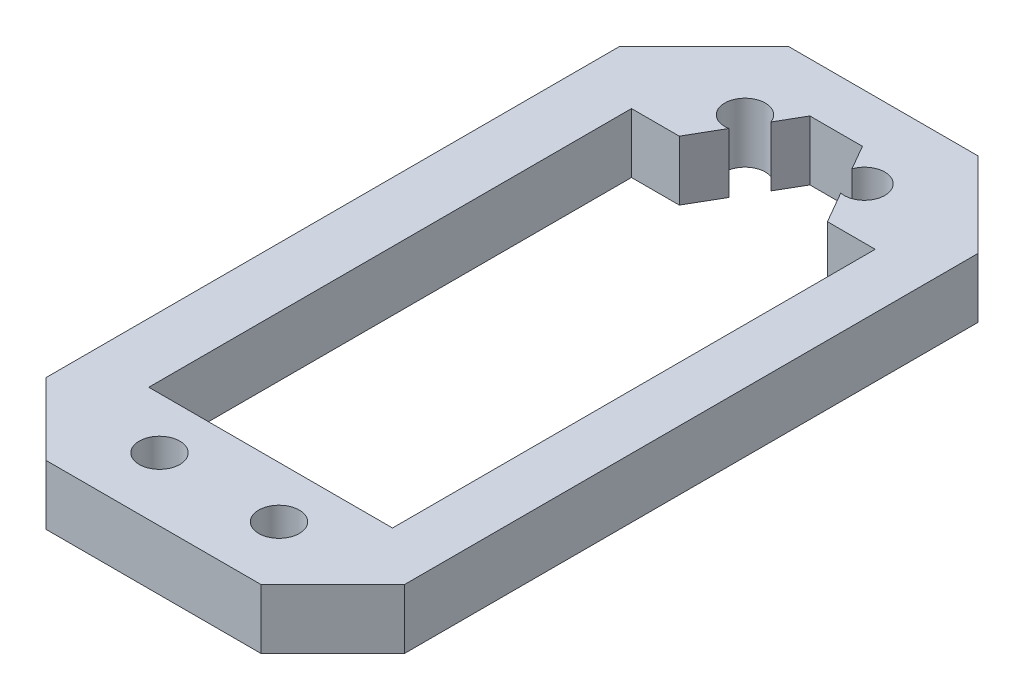
ISO-10303-21;
HEADER;
FILE_DESCRIPTION(('STEP AP214'),'2;1');
FILE_NAME('part.step','',(''),(''),'','','');
FILE_SCHEMA(('AUTOMOTIVE_DESIGN { 1 0 10303 214 1 1 1 1 }'));
ENDSEC;
DATA;
#1=APPLICATION_CONTEXT('core data for automotive mechanical design processes');
#2=APPLICATION_PROTOCOL_DEFINITION('international standard','automotive_design',2000,#1);
#3=PRODUCT_CONTEXT('',#1,'mechanical');
#4=PRODUCT('Part','Part','',(#3));
#5=PRODUCT_RELATED_PRODUCT_CATEGORY('part','',(#4));
#6=PRODUCT_DEFINITION_FORMATION('','',#4);
#7=PRODUCT_DEFINITION_CONTEXT('part definition',#1,'design');
#8=PRODUCT_DEFINITION('design','',#6,#7);
#9=PRODUCT_DEFINITION_SHAPE('','',#8);
#10=(LENGTH_UNIT() NAMED_UNIT(*) SI_UNIT(.MILLI.,.METRE.));
#11=(NAMED_UNIT(*) PLANE_ANGLE_UNIT() SI_UNIT($,.RADIAN.));
#12=(NAMED_UNIT(*) SI_UNIT($,.STERADIAN.) SOLID_ANGLE_UNIT());
#13=UNCERTAINTY_MEASURE_WITH_UNIT(LENGTH_MEASURE(1.E-05),#10,'distance_accuracy_value','');
#14=(GEOMETRIC_REPRESENTATION_CONTEXT(3) GLOBAL_UNCERTAINTY_ASSIGNED_CONTEXT((#13)) GLOBAL_UNIT_ASSIGNED_CONTEXT((#10,
#11,#12)) REPRESENTATION_CONTEXT('',''));
#15=CARTESIAN_POINT('',(0.,0.,0.));
#16=DIRECTION('',(0.,0.,1.));
#17=DIRECTION('',(1.,0.,0.));
#18=AXIS2_PLACEMENT_3D('',#15,#16,#17);
#19=CARTESIAN_POINT('',(0.,5.,0.));
#20=DIRECTION('',(0.,-1.,0.));
#21=DIRECTION('',(0.,0.,-1.));
#22=AXIS2_PLACEMENT_3D('',#19,#20,#21);
#23=PLANE('',#22);
#24=DIRECTION('',(-0.707106781186547,0.,-0.707106781186547));
#25=VECTOR('',#24,1.);
#26=CARTESIAN_POINT('',(1439.01159534853,5.,-1417.86320996286));
#27=LINE('',#26,#25);
#28=CARTESIAN_POINT('',(1439.01159534853,5.,-1417.86320996286));
#29=VERTEX_POINT('',#28);
#30=CARTESIAN_POINT('',(1431.94052753666,5.,-1424.93427777473));
#31=VERTEX_POINT('',#30);
#32=EDGE_CURVE('E319',#29,#31,#27,.T.);
#33=ORIENTED_EDGE('',*,*,#32,.T.);
#34=DIRECTION('',(-1.,0.,0.));
#35=VECTOR('',#34,1.);
#36=CARTESIAN_POINT('',(1431.94052753666,5.,-1424.93427777473));
#37=LINE('',#36,#35);
#38=CARTESIAN_POINT('',(1416.08266316039,5.,-1424.93427777473));
#39=VERTEX_POINT('',#38);
#40=EDGE_CURVE('E323',#31,#39,#37,.T.);
#41=ORIENTED_EDGE('',*,*,#40,.T.);
#42=DIRECTION('',(-0.707106781186547,0.,0.707106781186547));
#43=VECTOR('',#42,1.);
#44=CARTESIAN_POINT('',(1409.01159534853,5.,-1417.86320996286));
#45=LINE('',#44,#43);
#46=CARTESIAN_POINT('',(1409.01159534853,5.,-1417.86320996286));
#47=VERTEX_POINT('',#46);
#48=EDGE_CURVE('E327',#39,#47,#45,.T.);
#49=ORIENTED_EDGE('',*,*,#48,.T.);
#50=DIRECTION('',(0.,0.,1.));
#51=VECTOR('',#50,1.);
#52=CARTESIAN_POINT('',(1409.01159534853,5.,-1369.86320996286));
#53=LINE('',#52,#51);
#54=CARTESIAN_POINT('',(1409.01159534853,5.,-1369.86320996286));
#55=VERTEX_POINT('',#54);
#56=EDGE_CURVE('E330',#47,#55,#53,.T.);
#57=ORIENTED_EDGE('',*,*,#56,.T.);
#58=DIRECTION('',(0.707106781186547,0.,0.707106781186547));
#59=VECTOR('',#58,1.);
#60=CARTESIAN_POINT('',(1415.01159534853,5.,-1363.86320996286));
#61=LINE('',#60,#59);
#62=CARTESIAN_POINT('',(1415.01159534853,5.,-1363.86320996286));
#63=VERTEX_POINT('',#62);
#64=EDGE_CURVE('E333',#55,#63,#61,.T.);
#65=ORIENTED_EDGE('',*,*,#64,.T.);
#66=DIRECTION('',(1.,0.,0.));
#67=VECTOR('',#66,1.);
#68=CARTESIAN_POINT('',(1433.01159534853,5.,-1363.86320996286));
#69=LINE('',#68,#67);
#70=CARTESIAN_POINT('',(1433.01159534853,5.,-1363.86320996286));
#71=VERTEX_POINT('',#70);
#72=EDGE_CURVE('E336',#63,#71,#69,.T.);
#73=ORIENTED_EDGE('',*,*,#72,.T.);
#74=DIRECTION('',(0.707106781186547,0.,-0.707106781186547));
#75=VECTOR('',#74,1.);
#76=CARTESIAN_POINT('',(1439.01159534853,5.,-1369.86320996286));
#77=LINE('',#76,#75);
#78=CARTESIAN_POINT('',(1439.01159534853,5.,-1369.86320996286));
#79=VERTEX_POINT('',#78);
#80=EDGE_CURVE('E339',#71,#79,#77,.T.);
#81=ORIENTED_EDGE('',*,*,#80,.T.);
#82=DIRECTION('',(0.,0.,-1.));
#83=VECTOR('',#82,1.);
#84=CARTESIAN_POINT('',(1439.01159534853,5.,-1417.86320996286));
#85=LINE('',#84,#83);
#86=EDGE_CURVE('E342',#79,#29,#85,.T.);
#87=ORIENTED_EDGE('',*,*,#86,.T.);
#88=EDGE_LOOP('',(#33,#41,#49,#57,#65,#73,#81,#87));
#89=FACE_BOUND('',#88,.T.);
#90=DIRECTION('',(-1.,0.,0.));
#91=VECTOR('',#90,1.);
#92=CARTESIAN_POINT('',(1434.41159534853,5.,-1413.86320996286));
#93=LINE('',#92,#91);
#94=CARTESIAN_POINT('',(1434.41159534853,5.,-1413.86320996286));
#95=VERTEX_POINT('',#94);
#96=CARTESIAN_POINT('',(1430.41159534853,5.,-1413.86320996286));
#97=VERTEX_POINT('',#96);
#98=EDGE_CURVE('E187',#95,#97,#93,.T.);
#99=ORIENTED_EDGE('',*,*,#98,.F.);
#100=DIRECTION('',(0.,0.,-1.));
#101=VECTOR('',#100,1.);
#102=CARTESIAN_POINT('',(1434.41159534853,5.,-1413.86320996286));
#103=LINE('',#102,#101);
#104=CARTESIAN_POINT('',(1434.41159534853,5.,-1373.46320996286));
#105=VERTEX_POINT('',#104);
#106=EDGE_CURVE('E242',#105,#95,#103,.T.);
#107=ORIENTED_EDGE('',*,*,#106,.F.);
#108=DIRECTION('',(1.,0.,0.));
#109=VECTOR('',#108,1.);
#110=CARTESIAN_POINT('',(1434.41159534853,5.,-1373.46320996286));
#111=LINE('',#110,#109);
#112=CARTESIAN_POINT('',(1414.01159534853,5.,-1373.46320996286));
#113=VERTEX_POINT('',#112);
#114=EDGE_CURVE('E239',#113,#105,#111,.T.);
#115=ORIENTED_EDGE('',*,*,#114,.F.);
#116=DIRECTION('',(0.,0.,1.));
#117=VECTOR('',#116,1.);
#118=CARTESIAN_POINT('',(1414.01159534853,5.,-1373.46320996286));
#119=LINE('',#118,#117);
#120=CARTESIAN_POINT('',(1414.01159534853,5.,-1413.86320996286));
#121=VERTEX_POINT('',#120);
#122=EDGE_CURVE('E236',#121,#113,#119,.T.);
#123=ORIENTED_EDGE('',*,*,#122,.F.);
#124=DIRECTION('',(-1.,0.,0.));
#125=VECTOR('',#124,1.);
#126=CARTESIAN_POINT('',(1414.01159534853,5.,-1413.86320996286));
#127=LINE('',#126,#125);
#128=CARTESIAN_POINT('',(1418.01159534853,5.,-1413.86320996286));
#129=VERTEX_POINT('',#128);
#130=EDGE_CURVE('E233',#129,#121,#127,.T.);
#131=ORIENTED_EDGE('',*,*,#130,.F.);
#132=DIRECTION('',(-0.499999999999981,0.,0.866025403784449));
#133=VECTOR('',#132,1.);
#134=CARTESIAN_POINT('',(1418.01159534853,5.,-1413.86320996286));
#135=LINE('',#134,#133);
#136=CARTESIAN_POINT('',(1419.5300845279,5.,-1416.49331037228));
#137=VERTEX_POINT('',#136);
#138=EDGE_CURVE('E230',#137,#129,#135,.T.);
#139=ORIENTED_EDGE('',*,*,#138,.F.);
#140=CARTESIAN_POINT('',(1419.21159534853,5.,-1418.16320996286));
#141=DIRECTION('',(0.,1.,0.));
#142=DIRECTION('',(0.,0.,1.));
#143=AXIS2_PLACEMENT_3D('',#140,#141,#142);
#144=CIRCLE('',#143,1.69999999999992);
#145=CARTESIAN_POINT('',(1420.81701540543,5.,-1418.72234003799));
#146=VERTEX_POINT('',#145);
#147=EDGE_CURVE('E227',#146,#137,#144,.T.);
#148=ORIENTED_EDGE('',*,*,#147,.F.);
#149=DIRECTION('',(-0.49999999999999,0.,0.866025403784444));
#150=VECTOR('',#149,1.);
#151=CARTESIAN_POINT('',(1420.81701540543,5.,-1418.72234003799));
#152=LINE('',#151,#150);
#153=CARTESIAN_POINT('',(1422.01159534853,5.,-1420.79141319314));
#154=VERTEX_POINT('',#153);
#155=EDGE_CURVE('E224',#154,#146,#152,.T.);
#156=ORIENTED_EDGE('',*,*,#155,.F.);
#157=DIRECTION('',(-1.,0.,0.));
#158=VECTOR('',#157,1.);
#159=CARTESIAN_POINT('',(1426.41159534853,5.,-1420.79141319314));
#160=LINE('',#159,#158);
#161=CARTESIAN_POINT('',(1426.41159534853,5.,-1420.79141319314));
#162=VERTEX_POINT('',#161);
#163=EDGE_CURVE('E221',#162,#154,#160,.T.);
#164=ORIENTED_EDGE('',*,*,#163,.F.);
#165=DIRECTION('',(-0.500000000000049,0.,-0.86602540378441));
#166=VECTOR('',#165,1.);
#167=CARTESIAN_POINT('',(1427.60617529163,5.,-1418.72234003799));
#168=LINE('',#167,#166);
#169=CARTESIAN_POINT('',(1427.60617529163,5.,-1418.72234003799));
#170=VERTEX_POINT('',#169);
#171=EDGE_CURVE('E215',#170,#162,#168,.T.);
#172=ORIENTED_EDGE('',*,*,#171,.F.);
#173=CARTESIAN_POINT('',(1429.21159534853,5.,-1418.16320996286));
#174=DIRECTION('',(0.,1.,0.));
#175=DIRECTION('',(0.,0.,1.));
#176=AXIS2_PLACEMENT_3D('',#173,#174,#175);
#177=CIRCLE('',#176,1.7);
#178=CARTESIAN_POINT('',(1428.89310616915,5.,-1416.49331037228));
#179=VERTEX_POINT('',#178);
#180=EDGE_CURVE('E211',#179,#170,#177,.T.);
#181=ORIENTED_EDGE('',*,*,#180,.F.);
#182=DIRECTION('',(-0.499999999999918,0.,-0.866025403784486));
#183=VECTOR('',#182,1.);
#184=CARTESIAN_POINT('',(1430.41159534853,5.,-1413.86320996286));
#185=LINE('',#184,#183);
#186=EDGE_CURVE('E196',#97,#179,#185,.T.);
#187=ORIENTED_EDGE('',*,*,#186,.F.);
#188=EDGE_LOOP('',(#99,#107,#115,#123,#131,#139,#148,#156,#164,#172,#181,#187));
#189=FACE_BOUND('',#188,.T.);
#190=CARTESIAN_POINT('',(1429.21159534853,5.,-1369.16320996286));
#191=DIRECTION('',(0.,1.,0.));
#192=DIRECTION('',(0.,0.,1.));
#193=AXIS2_PLACEMENT_3D('',#190,#191,#192);
#194=CIRCLE('',#193,1.70000000000003);
#195=CARTESIAN_POINT('',(1429.21159534853,5.,-1367.46320996286));
#196=VERTEX_POINT('',#195);
#197=EDGE_CURVE('E247',#196,#196,#194,.T.);
#198=ORIENTED_EDGE('',*,*,#197,.F.);
#199=EDGE_LOOP('',(#198));
#200=FACE_BOUND('',#199,.T.);
#201=CARTESIAN_POINT('',(1419.21159534853,5.,-1369.16320996286));
#202=DIRECTION('',(0.,1.,0.));
#203=DIRECTION('',(0.,0.,1.));
#204=AXIS2_PLACEMENT_3D('',#201,#202,#203);
#205=CIRCLE('',#204,1.70000000000003);
#206=CARTESIAN_POINT('',(1419.21159534853,5.,-1367.46320996286));
#207=VERTEX_POINT('',#206);
#208=EDGE_CURVE('E513',#207,#207,#205,.T.);
#209=ORIENTED_EDGE('',*,*,#208,.F.);
#210=EDGE_LOOP('',(#209));
#211=FACE_BOUND('',#210,.T.);
#212=ADVANCED_FACE('F49',(#89,#189,#200,#211),#23,.F.);
#213=CARTESIAN_POINT('',(0.,0.,0.));
#214=DIRECTION('',(0.,-1.,0.));
#215=DIRECTION('',(0.,0.,-1.));
#216=AXIS2_PLACEMENT_3D('',#213,#214,#215);
#217=PLANE('',#216);
#218=CARTESIAN_POINT('',(1429.21159534853,0.,-1369.16320996286));
#219=DIRECTION('',(0.,1.,0.));
#220=DIRECTION('',(0.,0.,1.));
#221=AXIS2_PLACEMENT_3D('',#218,#219,#220);
#222=CIRCLE('',#221,1.70000000000003);
#223=CARTESIAN_POINT('',(1429.21159534853,0.,-1367.46320996286));
#224=VERTEX_POINT('',#223);
#225=EDGE_CURVE('E521',#224,#224,#222,.T.);
#226=ORIENTED_EDGE('',*,*,#225,.T.);
#227=EDGE_LOOP('',(#226));
#228=FACE_BOUND('',#227,.T.);
#229=DIRECTION('',(-0.707106781186547,0.,-0.707106781186547));
#230=VECTOR('',#229,1.);
#231=CARTESIAN_POINT('',(1439.01159534853,0.,-1417.86320996286));
#232=LINE('',#231,#230);
#233=CARTESIAN_POINT('',(1439.01159534853,0.,-1417.86320996286));
#234=VERTEX_POINT('',#233);
#235=CARTESIAN_POINT('',(1431.94052753666,0.,-1424.93427777473));
#236=VERTEX_POINT('',#235);
#237=EDGE_CURVE('E205',#234,#236,#232,.T.);
#238=ORIENTED_EDGE('',*,*,#237,.F.);
#239=DIRECTION('',(0.,0.,-1.));
#240=VECTOR('',#239,1.);
#241=CARTESIAN_POINT('',(1439.01159534853,0.,-1417.86320996286));
#242=LINE('',#241,#240);
#243=CARTESIAN_POINT('',(1439.01159534853,0.,-1369.86320996286));
#244=VERTEX_POINT('',#243);
#245=EDGE_CURVE('E324',#244,#234,#242,.T.);
#246=ORIENTED_EDGE('',*,*,#245,.F.);
#247=DIRECTION('',(0.707106781186547,0.,-0.707106781186547));
#248=VECTOR('',#247,1.);
#249=CARTESIAN_POINT('',(1439.01159534853,0.,-1369.86320996286));
#250=LINE('',#249,#248);
#251=CARTESIAN_POINT('',(1433.01159534853,0.,-1363.86320996286));
#252=VERTEX_POINT('',#251);
#253=EDGE_CURVE('E364',#252,#244,#250,.T.);
#254=ORIENTED_EDGE('',*,*,#253,.F.);
#255=DIRECTION('',(1.,0.,0.));
#256=VECTOR('',#255,1.);
#257=CARTESIAN_POINT('',(1433.01159534853,0.,-1363.86320996286));
#258=LINE('',#257,#256);
#259=CARTESIAN_POINT('',(1415.01159534853,0.,-1363.86320996286));
#260=VERTEX_POINT('',#259);
#261=EDGE_CURVE('E361',#260,#252,#258,.T.);
#262=ORIENTED_EDGE('',*,*,#261,.F.);
#263=DIRECTION('',(0.707106781186547,0.,0.707106781186547));
#264=VECTOR('',#263,1.);
#265=CARTESIAN_POINT('',(1415.01159534853,0.,-1363.86320996286));
#266=LINE('',#265,#264);
#267=CARTESIAN_POINT('',(1409.01159534853,0.,-1369.86320996286));
#268=VERTEX_POINT('',#267);
#269=EDGE_CURVE('E358',#268,#260,#266,.T.);
#270=ORIENTED_EDGE('',*,*,#269,.F.);
#271=DIRECTION('',(0.,0.,1.));
#272=VECTOR('',#271,1.);
#273=CARTESIAN_POINT('',(1409.01159534853,0.,-1369.86320996286));
#274=LINE('',#273,#272);
#275=CARTESIAN_POINT('',(1409.01159534853,0.,-1417.86320996286));
#276=VERTEX_POINT('',#275);
#277=EDGE_CURVE('E355',#276,#268,#274,.T.);
#278=ORIENTED_EDGE('',*,*,#277,.F.);
#279=DIRECTION('',(-0.707106781186547,0.,0.707106781186547));
#280=VECTOR('',#279,1.);
#281=CARTESIAN_POINT('',(1409.01159534853,0.,-1417.86320996286));
#282=LINE('',#281,#280);
#283=CARTESIAN_POINT('',(1416.08266316039,0.,-1424.93427777473));
#284=VERTEX_POINT('',#283);
#285=EDGE_CURVE('E352',#284,#276,#282,.T.);
#286=ORIENTED_EDGE('',*,*,#285,.F.);
#287=DIRECTION('',(-1.,0.,0.));
#288=VECTOR('',#287,1.);
#289=CARTESIAN_POINT('',(1431.94052753666,0.,-1424.93427777473));
#290=LINE('',#289,#288);
#291=EDGE_CURVE('E349',#236,#284,#290,.T.);
#292=ORIENTED_EDGE('',*,*,#291,.F.);
#293=EDGE_LOOP('',(#238,#246,#254,#262,#270,#278,#286,#292));
#294=FACE_BOUND('',#293,.T.);
#295=DIRECTION('',(0.,0.,-1.));
#296=VECTOR('',#295,1.);
#297=CARTESIAN_POINT('',(1434.41159534853,0.,-1413.86320996286));
#298=LINE('',#297,#296);
#299=CARTESIAN_POINT('',(1434.41159534853,0.,-1373.46320996286));
#300=VERTEX_POINT('',#299);
#301=CARTESIAN_POINT('',(1434.41159534853,0.,-1413.86320996286));
#302=VERTEX_POINT('',#301);
#303=EDGE_CURVE('E197',#300,#302,#298,.T.);
#304=ORIENTED_EDGE('',*,*,#303,.T.);
#305=DIRECTION('',(-1.,0.,0.));
#306=VECTOR('',#305,1.);
#307=CARTESIAN_POINT('',(1434.41159534853,0.,-1413.86320996286));
#308=LINE('',#307,#306);
#309=CARTESIAN_POINT('',(1430.41159534853,0.,-1413.86320996286));
#310=VERTEX_POINT('',#309);
#311=EDGE_CURVE('E73',#302,#310,#308,.T.);
#312=ORIENTED_EDGE('',*,*,#311,.T.);
#313=DIRECTION('',(-0.499999999999918,0.,-0.866025403784486));
#314=VECTOR('',#313,1.);
#315=CARTESIAN_POINT('',(1430.41159534853,0.,-1413.86320996286));
#316=LINE('',#315,#314);
#317=CARTESIAN_POINT('',(1428.89310616915,0.,-1416.49331037228));
#318=VERTEX_POINT('',#317);
#319=EDGE_CURVE('E203',#310,#318,#316,.T.);
#320=ORIENTED_EDGE('',*,*,#319,.T.);
#321=CARTESIAN_POINT('',(1429.21159534853,0.,-1418.16320996286));
#322=DIRECTION('',(0.,1.,0.));
#323=DIRECTION('',(0.,0.,1.));
#324=AXIS2_PLACEMENT_3D('',#321,#322,#323);
#325=CIRCLE('',#324,1.7);
#326=CARTESIAN_POINT('',(1427.60617529163,0.,-1418.72234003799));
#327=VERTEX_POINT('',#326);
#328=EDGE_CURVE('E250',#318,#327,#325,.T.);
#329=ORIENTED_EDGE('',*,*,#328,.T.);
#330=DIRECTION('',(-0.500000000000049,0.,-0.86602540378441));
#331=VECTOR('',#330,1.);
#332=CARTESIAN_POINT('',(1427.60617529163,0.,-1418.72234003799));
#333=LINE('',#332,#331);
#334=CARTESIAN_POINT('',(1426.41159534853,0.,-1420.79141319314));
#335=VERTEX_POINT('',#334);
#336=EDGE_CURVE('E254',#327,#335,#333,.T.);
#337=ORIENTED_EDGE('',*,*,#336,.T.);
#338=DIRECTION('',(-1.,0.,0.));
#339=VECTOR('',#338,1.);
#340=CARTESIAN_POINT('',(1426.41159534853,0.,-1420.79141319314));
#341=LINE('',#340,#339);
#342=CARTESIAN_POINT('',(1422.01159534853,0.,-1420.79141319314));
#343=VERTEX_POINT('',#342);
#344=EDGE_CURVE('E258',#335,#343,#341,.T.);
#345=ORIENTED_EDGE('',*,*,#344,.T.);
#346=DIRECTION('',(-0.49999999999999,0.,0.866025403784444));
#347=VECTOR('',#346,1.);
#348=CARTESIAN_POINT('',(1420.81701540543,0.,-1418.72234003799));
#349=LINE('',#348,#347);
#350=CARTESIAN_POINT('',(1420.81701540543,0.,-1418.72234003799));
#351=VERTEX_POINT('',#350);
#352=EDGE_CURVE('E262',#343,#351,#349,.T.);
#353=ORIENTED_EDGE('',*,*,#352,.T.);
#354=CARTESIAN_POINT('',(1419.21159534853,0.,-1418.16320996286));
#355=DIRECTION('',(0.,1.,0.));
#356=DIRECTION('',(0.,0.,1.));
#357=AXIS2_PLACEMENT_3D('',#354,#355,#356);
#358=CIRCLE('',#357,1.69999999999992);
#359=CARTESIAN_POINT('',(1419.5300845279,0.,-1416.49331037228));
#360=VERTEX_POINT('',#359);
#361=EDGE_CURVE('E266',#351,#360,#358,.T.);
#362=ORIENTED_EDGE('',*,*,#361,.T.);
#363=DIRECTION('',(-0.499999999999981,0.,0.866025403784449));
#364=VECTOR('',#363,1.);
#365=CARTESIAN_POINT('',(1418.01159534853,0.,-1413.86320996286));
#366=LINE('',#365,#364);
#367=CARTESIAN_POINT('',(1418.01159534853,0.,-1413.86320996286));
#368=VERTEX_POINT('',#367);
#369=EDGE_CURVE('E270',#360,#368,#366,.T.);
#370=ORIENTED_EDGE('',*,*,#369,.T.);
#371=DIRECTION('',(-1.,0.,0.));
#372=VECTOR('',#371,1.);
#373=CARTESIAN_POINT('',(1414.01159534853,0.,-1413.86320996286));
#374=LINE('',#373,#372);
#375=CARTESIAN_POINT('',(1414.01159534853,0.,-1413.86320996286));
#376=VERTEX_POINT('',#375);
#377=EDGE_CURVE('E274',#368,#376,#374,.T.);
#378=ORIENTED_EDGE('',*,*,#377,.T.);
#379=DIRECTION('',(0.,0.,1.));
#380=VECTOR('',#379,1.);
#381=CARTESIAN_POINT('',(1414.01159534853,0.,-1373.46320996286));
#382=LINE('',#381,#380);
#383=CARTESIAN_POINT('',(1414.01159534853,0.,-1373.46320996286));
#384=VERTEX_POINT('',#383);
#385=EDGE_CURVE('E278',#376,#384,#382,.T.);
#386=ORIENTED_EDGE('',*,*,#385,.T.);
#387=DIRECTION('',(1.,0.,0.));
#388=VECTOR('',#387,1.);
#389=CARTESIAN_POINT('',(1434.41159534853,0.,-1373.46320996286));
#390=LINE('',#389,#388);
#391=EDGE_CURVE('E282',#384,#300,#390,.T.);
#392=ORIENTED_EDGE('',*,*,#391,.T.);
#393=EDGE_LOOP('',(#304,#312,#320,#329,#337,#345,#353,#362,#370,#378,#386,#392));
#394=FACE_BOUND('',#393,.T.);
#395=CARTESIAN_POINT('',(1419.21159534853,0.,-1369.16320996286));
#396=DIRECTION('',(0.,1.,0.));
#397=DIRECTION('',(0.,0.,1.));
#398=AXIS2_PLACEMENT_3D('',#395,#396,#397);
#399=CIRCLE('',#398,1.70000000000003);
#400=CARTESIAN_POINT('',(1419.21159534853,0.,-1367.46320996286));
#401=VERTEX_POINT('',#400);
#402=EDGE_CURVE('E516',#401,#401,#399,.T.);
#403=ORIENTED_EDGE('',*,*,#402,.T.);
#404=EDGE_LOOP('',(#403));
#405=FACE_BOUND('',#404,.T.);
#406=ADVANCED_FACE('F403',(#228,#294,#394,#405),#217,.T.);
#407=CARTESIAN_POINT('',(1439.01159534853,5.,-1417.86320996286));
#408=DIRECTION('',(-0.707106781186548,0.,0.707106781186548));
#409=DIRECTION('',(0.707106781186548,0.,0.707106781186548));
#410=AXIS2_PLACEMENT_3D('',#407,#408,#409);
#411=PLANE('',#410);
#412=ORIENTED_EDGE('',*,*,#237,.T.);
#413=DIRECTION('',(0.,-1.,0.));
#414=VECTOR('',#413,1.);
#415=CARTESIAN_POINT('',(1431.94052753666,5.,-1424.93427777473));
#416=LINE('',#415,#414);
#417=EDGE_CURVE('E11',#31,#236,#416,.T.);
#418=ORIENTED_EDGE('',*,*,#417,.F.);
#419=ORIENTED_EDGE('',*,*,#32,.F.);
#420=DIRECTION('',(0.,-1.,0.));
#421=VECTOR('',#420,1.);
#422=CARTESIAN_POINT('',(1439.01159534853,5.,-1417.86320996286));
#423=LINE('',#422,#421);
#424=EDGE_CURVE('E345',#29,#234,#423,.T.);
#425=ORIENTED_EDGE('',*,*,#424,.T.);
#426=EDGE_LOOP('',(#412,#418,#419,#425));
#427=FACE_BOUND('',#426,.T.);
#428=ADVANCED_FACE('F51',(#427),#411,.F.);
#429=CARTESIAN_POINT('',(1431.94052753666,5.,-1424.93427777473));
#430=DIRECTION('',(0.,0.,1.));
#431=DIRECTION('',(1.,0.,0.));
#432=AXIS2_PLACEMENT_3D('',#429,#430,#431);
#433=PLANE('',#432);
#434=ORIENTED_EDGE('',*,*,#291,.T.);
#435=DIRECTION('',(0.,-1.,0.));
#436=VECTOR('',#435,1.);
#437=CARTESIAN_POINT('',(1416.08266316039,5.,-1424.93427777473));
#438=LINE('',#437,#436);
#439=EDGE_CURVE('E58',#39,#284,#438,.T.);
#440=ORIENTED_EDGE('',*,*,#439,.F.);
#441=ORIENTED_EDGE('',*,*,#40,.F.);
#442=ORIENTED_EDGE('',*,*,#417,.T.);
#443=EDGE_LOOP('',(#434,#440,#441,#442));
#444=FACE_BOUND('',#443,.T.);
#445=ADVANCED_FACE('F420',(#444),#433,.F.);
#446=CARTESIAN_POINT('',(1409.01159534853,5.,-1417.86320996286));
#447=DIRECTION('',(0.707106781186548,0.,0.707106781186548));
#448=DIRECTION('',(0.707106781186548,0.,-0.707106781186548));
#449=AXIS2_PLACEMENT_3D('',#446,#447,#448);
#450=PLANE('',#449);
#451=ORIENTED_EDGE('',*,*,#285,.T.);
#452=DIRECTION('',(0.,-1.,0.));
#453=VECTOR('',#452,1.);
#454=CARTESIAN_POINT('',(1409.01159534853,5.,-1417.86320996286));
#455=LINE('',#454,#453);
#456=EDGE_CURVE('E388',#47,#276,#455,.T.);
#457=ORIENTED_EDGE('',*,*,#456,.F.);
#458=ORIENTED_EDGE('',*,*,#48,.F.);
#459=ORIENTED_EDGE('',*,*,#439,.T.);
#460=EDGE_LOOP('',(#451,#457,#458,#459));
#461=FACE_BOUND('',#460,.T.);
#462=ADVANCED_FACE('F397',(#461),#450,.F.);
#463=CARTESIAN_POINT('',(1409.01159534853,5.,-1369.86320996286));
#464=DIRECTION('',(1.,0.,0.));
#465=DIRECTION('',(0.,0.,-1.));
#466=AXIS2_PLACEMENT_3D('',#463,#464,#465);
#467=PLANE('',#466);
#468=ORIENTED_EDGE('',*,*,#277,.T.);
#469=DIRECTION('',(0.,-1.,0.));
#470=VECTOR('',#469,1.);
#471=CARTESIAN_POINT('',(1409.01159534853,5.,-1369.86320996286));
#472=LINE('',#471,#470);
#473=EDGE_CURVE('E384',#55,#268,#472,.T.);
#474=ORIENTED_EDGE('',*,*,#473,.F.);
#475=ORIENTED_EDGE('',*,*,#56,.F.);
#476=ORIENTED_EDGE('',*,*,#456,.T.);
#477=EDGE_LOOP('',(#468,#474,#475,#476));
#478=FACE_BOUND('',#477,.T.);
#479=ADVANCED_FACE('F409',(#478),#467,.F.);
#480=CARTESIAN_POINT('',(1415.01159534853,5.,-1363.86320996286));
#481=DIRECTION('',(0.707106781186548,0.,-0.707106781186548));
#482=DIRECTION('',(-0.707106781186548,0.,-0.707106781186548));
#483=AXIS2_PLACEMENT_3D('',#480,#481,#482);
#484=PLANE('',#483);
#485=ORIENTED_EDGE('',*,*,#269,.T.);
#486=DIRECTION('',(0.,-1.,0.));
#487=VECTOR('',#486,1.);
#488=CARTESIAN_POINT('',(1415.01159534853,5.,-1363.86320996286));
#489=LINE('',#488,#487);
#490=EDGE_CURVE('E380',#63,#260,#489,.T.);
#491=ORIENTED_EDGE('',*,*,#490,.F.);
#492=ORIENTED_EDGE('',*,*,#64,.F.);
#493=ORIENTED_EDGE('',*,*,#473,.T.);
#494=EDGE_LOOP('',(#485,#491,#492,#493));
#495=FACE_BOUND('',#494,.T.);
#496=ADVANCED_FACE('F413',(#495),#484,.F.);
#497=CARTESIAN_POINT('',(1433.01159534853,5.,-1363.86320996286));
#498=DIRECTION('',(0.,0.,-1.));
#499=DIRECTION('',(-1.,0.,0.));
#500=AXIS2_PLACEMENT_3D('',#497,#498,#499);
#501=PLANE('',#500);
#502=ORIENTED_EDGE('',*,*,#261,.T.);
#503=DIRECTION('',(0.,-1.,0.));
#504=VECTOR('',#503,1.);
#505=CARTESIAN_POINT('',(1433.01159534853,5.,-1363.86320996286));
#506=LINE('',#505,#504);
#507=EDGE_CURVE('E376',#71,#252,#506,.T.);
#508=ORIENTED_EDGE('',*,*,#507,.F.);
#509=ORIENTED_EDGE('',*,*,#72,.F.);
#510=ORIENTED_EDGE('',*,*,#490,.T.);
#511=EDGE_LOOP('',(#502,#508,#509,#510));
#512=FACE_BOUND('',#511,.T.);
#513=ADVANCED_FACE('F433',(#512),#501,.F.);
#514=CARTESIAN_POINT('',(1439.01159534853,5.,-1369.86320996286));
#515=DIRECTION('',(-0.707106781186548,0.,-0.707106781186548));
#516=DIRECTION('',(-0.707106781186548,0.,0.707106781186548));
#517=AXIS2_PLACEMENT_3D('',#514,#515,#516);
#518=PLANE('',#517);
#519=ORIENTED_EDGE('',*,*,#253,.T.);
#520=DIRECTION('',(0.,-1.,0.));
#521=VECTOR('',#520,1.);
#522=CARTESIAN_POINT('',(1439.01159534853,5.,-1369.86320996286));
#523=LINE('',#522,#521);
#524=EDGE_CURVE('E372',#79,#244,#523,.T.);
#525=ORIENTED_EDGE('',*,*,#524,.F.);
#526=ORIENTED_EDGE('',*,*,#80,.F.);
#527=ORIENTED_EDGE('',*,*,#507,.T.);
#528=EDGE_LOOP('',(#519,#525,#526,#527));
#529=FACE_BOUND('',#528,.T.);
#530=ADVANCED_FACE('F431',(#529),#518,.F.);
#531=CARTESIAN_POINT('',(1439.01159534853,5.,-1417.86320996286));
#532=DIRECTION('',(-1.,0.,0.));
#533=DIRECTION('',(0.,0.,1.));
#534=AXIS2_PLACEMENT_3D('',#531,#532,#533);
#535=PLANE('',#534);
#536=ORIENTED_EDGE('',*,*,#245,.T.);
#537=ORIENTED_EDGE('',*,*,#424,.F.);
#538=ORIENTED_EDGE('',*,*,#86,.F.);
#539=ORIENTED_EDGE('',*,*,#524,.T.);
#540=EDGE_LOOP('',(#536,#537,#538,#539));
#541=FACE_BOUND('',#540,.T.);
#542=ADVANCED_FACE('F426',(#541),#535,.F.);
#543=CARTESIAN_POINT('',(1434.41159534853,5.,-1413.86320996286));
#544=DIRECTION('',(0.,0.,1.));
#545=DIRECTION('',(1.,0.,0.));
#546=AXIS2_PLACEMENT_3D('',#543,#544,#545);
#547=PLANE('',#546);
#548=ORIENTED_EDGE('',*,*,#311,.F.);
#549=DIRECTION('',(0.,-1.,0.));
#550=VECTOR('',#549,1.);
#551=CARTESIAN_POINT('',(1434.41159534853,5.,-1413.86320996286));
#552=LINE('',#551,#550);
#553=EDGE_CURVE('E191',#95,#302,#552,.T.);
#554=ORIENTED_EDGE('',*,*,#553,.F.);
#555=ORIENTED_EDGE('',*,*,#98,.T.);
#556=DIRECTION('',(0.,-1.,0.));
#557=VECTOR('',#556,1.);
#558=CARTESIAN_POINT('',(1430.41159534853,5.,-1413.86320996286));
#559=LINE('',#558,#557);
#560=EDGE_CURVE('E190',#97,#310,#559,.T.);
#561=ORIENTED_EDGE('',*,*,#560,.T.);
#562=EDGE_LOOP('',(#548,#554,#555,#561));
#563=FACE_BOUND('',#562,.T.);
#564=ADVANCED_FACE('F189',(#563),#547,.T.);
#565=CARTESIAN_POINT('',(1430.41159534853,5.,-1413.86320996286));
#566=DIRECTION('',(-0.866025403784486,0.,0.499999999999918));
#567=DIRECTION('',(0.499999999999918,0.,0.866025403784486));
#568=AXIS2_PLACEMENT_3D('',#565,#566,#567);
#569=PLANE('',#568);
#570=ORIENTED_EDGE('',*,*,#319,.F.);
#571=ORIENTED_EDGE('',*,*,#560,.F.);
#572=ORIENTED_EDGE('',*,*,#186,.T.);
#573=DIRECTION('',(0.,-1.,0.));
#574=VECTOR('',#573,1.);
#575=CARTESIAN_POINT('',(1428.89310616915,5.,-1416.49331037228));
#576=LINE('',#575,#574);
#577=EDGE_CURVE('E206',#179,#318,#576,.T.);
#578=ORIENTED_EDGE('',*,*,#577,.T.);
#579=EDGE_LOOP('',(#570,#571,#572,#578));
#580=FACE_BOUND('',#579,.T.);
#581=ADVANCED_FACE('F200',(#580),#569,.T.);
#582=CARTESIAN_POINT('',(1429.21159534853,5.,-1418.16320996286));
#583=DIRECTION('',(0.,-1.,0.));
#584=DIRECTION('',(0.,0.,-1.));
#585=AXIS2_PLACEMENT_3D('',#582,#583,#584);
#586=CYLINDRICAL_SURFACE('',#585,1.7);
#587=ORIENTED_EDGE('',*,*,#328,.F.);
#588=ORIENTED_EDGE('',*,*,#577,.F.);
#589=ORIENTED_EDGE('',*,*,#180,.T.);
#590=DIRECTION('',(0.,-1.,0.));
#591=VECTOR('',#590,1.);
#592=CARTESIAN_POINT('',(1427.60617529163,5.,-1418.72234003799));
#593=LINE('',#592,#591);
#594=EDGE_CURVE('E314',#170,#327,#593,.T.);
#595=ORIENTED_EDGE('',*,*,#594,.T.);
#596=EDGE_LOOP('',(#587,#588,#589,#595));
#597=FACE_BOUND('',#596,.T.);
#598=ADVANCED_FACE('F459',(#597),#586,.F.);
#599=CARTESIAN_POINT('',(1427.60617529163,5.,-1418.72234003799));
#600=DIRECTION('',(-0.86602540378441,0.,0.500000000000049));
#601=DIRECTION('',(0.500000000000049,0.,0.86602540378441));
#602=AXIS2_PLACEMENT_3D('',#599,#600,#601);
#603=PLANE('',#602);
#604=ORIENTED_EDGE('',*,*,#336,.F.);
#605=ORIENTED_EDGE('',*,*,#594,.F.);
#606=ORIENTED_EDGE('',*,*,#171,.T.);
#607=DIRECTION('',(0.,-1.,0.));
#608=VECTOR('',#607,1.);
#609=CARTESIAN_POINT('',(1426.41159534853,5.,-1420.79141319314));
#610=LINE('',#609,#608);
#611=EDGE_CURVE('E311',#162,#335,#610,.T.);
#612=ORIENTED_EDGE('',*,*,#611,.T.);
#613=EDGE_LOOP('',(#604,#605,#606,#612));
#614=FACE_BOUND('',#613,.T.);
#615=ADVANCED_FACE('F463',(#614),#603,.T.);
#616=CARTESIAN_POINT('',(1426.41159534853,5.,-1420.79141319314));
#617=DIRECTION('',(0.,0.,1.));
#618=DIRECTION('',(1.,0.,0.));
#619=AXIS2_PLACEMENT_3D('',#616,#617,#618);
#620=PLANE('',#619);
#621=ORIENTED_EDGE('',*,*,#344,.F.);
#622=ORIENTED_EDGE('',*,*,#611,.F.);
#623=ORIENTED_EDGE('',*,*,#163,.T.);
#624=DIRECTION('',(0.,-1.,0.));
#625=VECTOR('',#624,1.);
#626=CARTESIAN_POINT('',(1422.01159534853,5.,-1420.79141319314));
#627=LINE('',#626,#625);
#628=EDGE_CURVE('E308',#154,#343,#627,.T.);
#629=ORIENTED_EDGE('',*,*,#628,.T.);
#630=EDGE_LOOP('',(#621,#622,#623,#629));
#631=FACE_BOUND('',#630,.T.);
#632=ADVANCED_FACE('F469',(#631),#620,.T.);
#633=CARTESIAN_POINT('',(1420.81701540543,5.,-1418.72234003799));
#634=DIRECTION('',(0.866025403784444,0.,0.49999999999999));
#635=DIRECTION('',(0.49999999999999,0.,-0.866025403784444));
#636=AXIS2_PLACEMENT_3D('',#633,#634,#635);
#637=PLANE('',#636);
#638=ORIENTED_EDGE('',*,*,#352,.F.);
#639=ORIENTED_EDGE('',*,*,#628,.F.);
#640=ORIENTED_EDGE('',*,*,#155,.T.);
#641=DIRECTION('',(0.,-1.,0.));
#642=VECTOR('',#641,1.);
#643=CARTESIAN_POINT('',(1420.81701540543,5.,-1418.72234003799));
#644=LINE('',#643,#642);
#645=EDGE_CURVE('E305',#146,#351,#644,.T.);
#646=ORIENTED_EDGE('',*,*,#645,.T.);
#647=EDGE_LOOP('',(#638,#639,#640,#646));
#648=FACE_BOUND('',#647,.T.);
#649=ADVANCED_FACE('F473',(#648),#637,.T.);
#650=CARTESIAN_POINT('',(1419.21159534853,5.,-1418.16320996286));
#651=DIRECTION('',(0.,-1.,0.));
#652=DIRECTION('',(0.,0.,-1.));
#653=AXIS2_PLACEMENT_3D('',#650,#651,#652);
#654=CYLINDRICAL_SURFACE('',#653,1.69999999999992);
#655=ORIENTED_EDGE('',*,*,#361,.F.);
#656=ORIENTED_EDGE('',*,*,#645,.F.);
#657=ORIENTED_EDGE('',*,*,#147,.T.);
#658=DIRECTION('',(0.,-1.,0.));
#659=VECTOR('',#658,1.);
#660=CARTESIAN_POINT('',(1419.5300845279,5.,-1416.49331037228));
#661=LINE('',#660,#659);
#662=EDGE_CURVE('E302',#137,#360,#661,.T.);
#663=ORIENTED_EDGE('',*,*,#662,.T.);
#664=EDGE_LOOP('',(#655,#656,#657,#663));
#665=FACE_BOUND('',#664,.T.);
#666=ADVANCED_FACE('F477',(#665),#654,.F.);
#667=CARTESIAN_POINT('',(1418.01159534853,5.,-1413.86320996286));
#668=DIRECTION('',(0.86602540378445,0.,0.499999999999981));
#669=DIRECTION('',(0.499999999999981,0.,-0.86602540378445));
#670=AXIS2_PLACEMENT_3D('',#667,#668,#669);
#671=PLANE('',#670);
#672=ORIENTED_EDGE('',*,*,#369,.F.);
#673=ORIENTED_EDGE('',*,*,#662,.F.);
#674=ORIENTED_EDGE('',*,*,#138,.T.);
#675=DIRECTION('',(0.,-1.,0.));
#676=VECTOR('',#675,1.);
#677=CARTESIAN_POINT('',(1418.01159534853,5.,-1413.86320996286));
#678=LINE('',#677,#676);
#679=EDGE_CURVE('E299',#129,#368,#678,.T.);
#680=ORIENTED_EDGE('',*,*,#679,.T.);
#681=EDGE_LOOP('',(#672,#673,#674,#680));
#682=FACE_BOUND('',#681,.T.);
#683=ADVANCED_FACE('F481',(#682),#671,.T.);
#684=CARTESIAN_POINT('',(1414.01159534853,5.,-1413.86320996286));
#685=DIRECTION('',(0.,0.,1.));
#686=DIRECTION('',(1.,0.,0.));
#687=AXIS2_PLACEMENT_3D('',#684,#685,#686);
#688=PLANE('',#687);
#689=ORIENTED_EDGE('',*,*,#377,.F.);
#690=ORIENTED_EDGE('',*,*,#679,.F.);
#691=ORIENTED_EDGE('',*,*,#130,.T.);
#692=DIRECTION('',(0.,-1.,0.));
#693=VECTOR('',#692,1.);
#694=CARTESIAN_POINT('',(1414.01159534853,5.,-1413.86320996286));
#695=LINE('',#694,#693);
#696=EDGE_CURVE('E296',#121,#376,#695,.T.);
#697=ORIENTED_EDGE('',*,*,#696,.T.);
#698=EDGE_LOOP('',(#689,#690,#691,#697));
#699=FACE_BOUND('',#698,.T.);
#700=ADVANCED_FACE('F485',(#699),#688,.T.);
#701=CARTESIAN_POINT('',(1414.01159534853,5.,-1373.46320996286));
#702=DIRECTION('',(1.,0.,0.));
#703=DIRECTION('',(0.,0.,-1.));
#704=AXIS2_PLACEMENT_3D('',#701,#702,#703);
#705=PLANE('',#704);
#706=ORIENTED_EDGE('',*,*,#385,.F.);
#707=ORIENTED_EDGE('',*,*,#696,.F.);
#708=ORIENTED_EDGE('',*,*,#122,.T.);
#709=DIRECTION('',(0.,-1.,0.));
#710=VECTOR('',#709,1.);
#711=CARTESIAN_POINT('',(1414.01159534853,5.,-1373.46320996286));
#712=LINE('',#711,#710);
#713=EDGE_CURVE('E293',#113,#384,#712,.T.);
#714=ORIENTED_EDGE('',*,*,#713,.T.);
#715=EDGE_LOOP('',(#706,#707,#708,#714));
#716=FACE_BOUND('',#715,.T.);
#717=ADVANCED_FACE('F489',(#716),#705,.T.);
#718=CARTESIAN_POINT('',(1434.41159534853,5.,-1373.46320996286));
#719=DIRECTION('',(0.,0.,-1.));
#720=DIRECTION('',(-1.,0.,0.));
#721=AXIS2_PLACEMENT_3D('',#718,#719,#720);
#722=PLANE('',#721);
#723=ORIENTED_EDGE('',*,*,#391,.F.);
#724=ORIENTED_EDGE('',*,*,#713,.F.);
#725=ORIENTED_EDGE('',*,*,#114,.T.);
#726=DIRECTION('',(0.,-1.,0.));
#727=VECTOR('',#726,1.);
#728=CARTESIAN_POINT('',(1434.41159534853,5.,-1373.46320996286));
#729=LINE('',#728,#727);
#730=EDGE_CURVE('E65',#105,#300,#729,.T.);
#731=ORIENTED_EDGE('',*,*,#730,.T.);
#732=EDGE_LOOP('',(#723,#724,#725,#731));
#733=FACE_BOUND('',#732,.T.);
#734=ADVANCED_FACE('F493',(#733),#722,.T.);
#735=CARTESIAN_POINT('',(1434.41159534853,5.,-1413.86320996286));
#736=DIRECTION('',(-1.,0.,0.));
#737=DIRECTION('',(0.,0.,1.));
#738=AXIS2_PLACEMENT_3D('',#735,#736,#737);
#739=PLANE('',#738);
#740=ORIENTED_EDGE('',*,*,#303,.F.);
#741=ORIENTED_EDGE('',*,*,#730,.F.);
#742=ORIENTED_EDGE('',*,*,#106,.T.);
#743=ORIENTED_EDGE('',*,*,#553,.T.);
#744=EDGE_LOOP('',(#740,#741,#742,#743));
#745=FACE_BOUND('',#744,.T.);
#746=ADVANCED_FACE('F497',(#745),#739,.T.);
#747=CARTESIAN_POINT('',(1429.21159534853,5.,-1369.16320996286));
#748=DIRECTION('',(0.,-1.,0.));
#749=DIRECTION('',(0.,0.,-1.));
#750=AXIS2_PLACEMENT_3D('',#747,#748,#749);
#751=CYLINDRICAL_SURFACE('',#750,1.70000000000003);
#752=ORIENTED_EDGE('',*,*,#197,.T.);
#753=EDGE_LOOP('',(#752));
#754=FACE_BOUND('',#753,.T.);
#755=ORIENTED_EDGE('',*,*,#225,.F.);
#756=EDGE_LOOP('',(#755));
#757=FACE_BOUND('',#756,.T.);
#758=ADVANCED_FACE('F501',(#754,#757),#751,.F.);
#759=CARTESIAN_POINT('',(1419.21159534853,5.,-1369.16320996286));
#760=DIRECTION('',(0.,-1.,0.));
#761=DIRECTION('',(0.,0.,-1.));
#762=AXIS2_PLACEMENT_3D('',#759,#760,#761);
#763=CYLINDRICAL_SURFACE('',#762,1.70000000000003);
#764=ORIENTED_EDGE('',*,*,#208,.T.);
#765=EDGE_LOOP('',(#764));
#766=FACE_BOUND('',#765,.T.);
#767=ORIENTED_EDGE('',*,*,#402,.F.);
#768=EDGE_LOOP('',(#767));
#769=FACE_BOUND('',#768,.T.);
#770=ADVANCED_FACE('F504',(#766,#769),#763,.F.);
#771=CLOSED_SHELL('',(#212,#406,#428,#445,#462,#479,#496,#513,#530,#542,#564,#581,#598,#615,
#632,#649,#666,#683,#700,#717,#734,#746,#758,#770));
#772=MANIFOLD_SOLID_BREP('B2',#771);
#773=ADVANCED_BREP_SHAPE_REPRESENTATION('',(#18,#772),#14);
#774=SHAPE_DEFINITION_REPRESENTATION(#9,#773);
ENDSEC;
END-ISO-10303-21;
